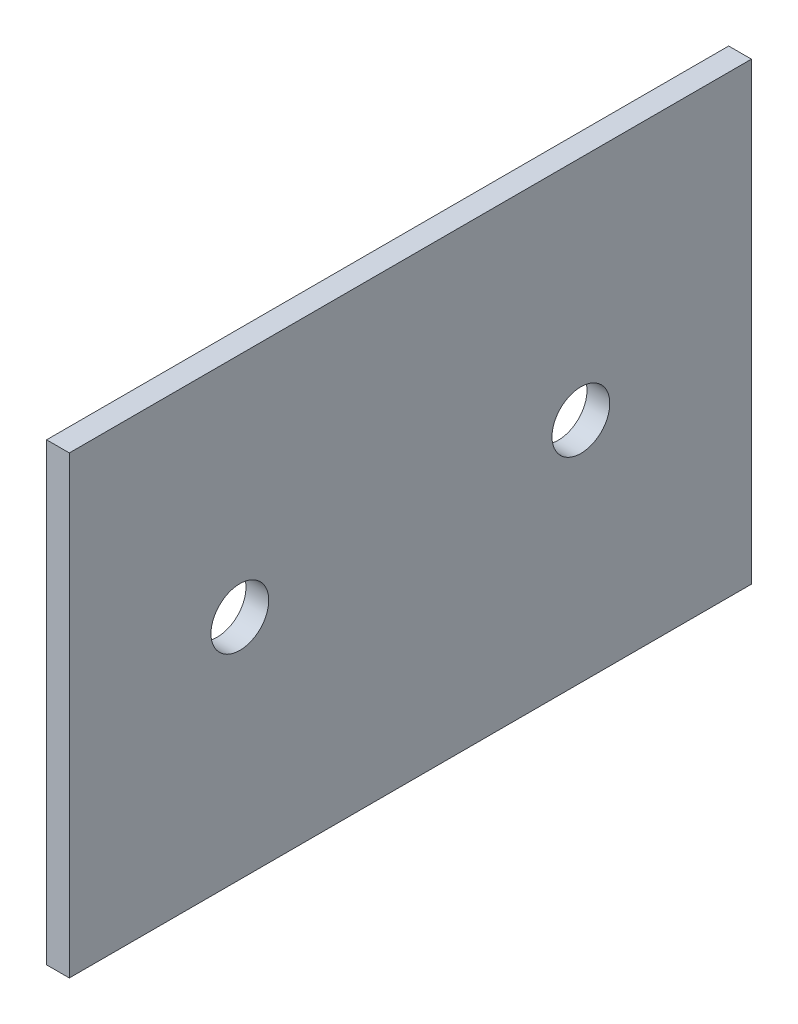
ISO-10303-21;
HEADER;
FILE_DESCRIPTION(('STEP AP214'),'2;1');
FILE_NAME('part.step','',(''),(''),'','','');
FILE_SCHEMA(('AUTOMOTIVE_DESIGN { 1 0 10303 214 1 1 1 1 }'));
ENDSEC;
DATA;
#1=APPLICATION_CONTEXT('core data for automotive mechanical design processes');
#2=APPLICATION_PROTOCOL_DEFINITION('international standard','automotive_design',2000,#1);
#3=PRODUCT_CONTEXT('',#1,'mechanical');
#4=PRODUCT('Part','Part','',(#3));
#5=PRODUCT_RELATED_PRODUCT_CATEGORY('part','',(#4));
#6=PRODUCT_DEFINITION_FORMATION('','',#4);
#7=PRODUCT_DEFINITION_CONTEXT('part definition',#1,'design');
#8=PRODUCT_DEFINITION('design','',#6,#7);
#9=PRODUCT_DEFINITION_SHAPE('','',#8);
#10=(LENGTH_UNIT() NAMED_UNIT(*) SI_UNIT(.MILLI.,.METRE.));
#11=(NAMED_UNIT(*) PLANE_ANGLE_UNIT() SI_UNIT($,.RADIAN.));
#12=(NAMED_UNIT(*) SI_UNIT($,.STERADIAN.) SOLID_ANGLE_UNIT());
#13=UNCERTAINTY_MEASURE_WITH_UNIT(LENGTH_MEASURE(1.E-05),#10,'distance_accuracy_value','');
#14=(GEOMETRIC_REPRESENTATION_CONTEXT(3) GLOBAL_UNCERTAINTY_ASSIGNED_CONTEXT((#13)) GLOBAL_UNIT_ASSIGNED_CONTEXT((#10,
#11,#12)) REPRESENTATION_CONTEXT('',''));
#15=CARTESIAN_POINT('',(0.,0.,0.));
#16=DIRECTION('',(0.,0.,1.));
#17=DIRECTION('',(1.,0.,0.));
#18=AXIS2_PLACEMENT_3D('',#15,#16,#17);
#19=CARTESIAN_POINT('',(110.,-100.,0.));
#20=DIRECTION('',(1.,0.,0.));
#21=DIRECTION('',(0.,1.,0.));
#22=AXIS2_PLACEMENT_3D('',#19,#20,#21);
#23=PLANE('',#22);
#24=CARTESIAN_POINT('',(110.,0.,225.));
#25=DIRECTION('',(1.,0.,0.));
#26=DIRECTION('',(0.,0.,1.));
#27=AXIS2_PLACEMENT_3D('',#24,#25,#26);
#28=CIRCLE('',#27,12.7);
#29=CARTESIAN_POINT('',(110.,0.,237.7));
#30=VERTEX_POINT('',#29);
#31=EDGE_CURVE('E10',#30,#30,#28,.T.);
#32=ORIENTED_EDGE('',*,*,#31,.F.);
#33=EDGE_LOOP('',(#32));
#34=FACE_BOUND('',#33,.T.);
#35=CARTESIAN_POINT('',(110.,0.,75.));
#36=DIRECTION('',(1.,0.,0.));
#37=DIRECTION('',(0.,0.,1.));
#38=AXIS2_PLACEMENT_3D('',#35,#36,#37);
#39=CIRCLE('',#38,12.7);
#40=CARTESIAN_POINT('',(110.,0.,87.7));
#41=VERTEX_POINT('',#40);
#42=EDGE_CURVE('E20',#41,#41,#39,.T.);
#43=ORIENTED_EDGE('',*,*,#42,.F.);
#44=EDGE_LOOP('',(#43));
#45=FACE_BOUND('',#44,.T.);
#46=DIRECTION('',(0.,0.,1.));
#47=VECTOR('',#46,1.);
#48=CARTESIAN_POINT('',(110.,-100.,0.));
#49=LINE('',#48,#47);
#50=CARTESIAN_POINT('',(110.,-100.,0.));
#51=VERTEX_POINT('',#50);
#52=CARTESIAN_POINT('',(110.,-100.,300.));
#53=VERTEX_POINT('',#52);
#54=EDGE_CURVE('E107',#51,#53,#49,.T.);
#55=ORIENTED_EDGE('',*,*,#54,.F.);
#56=DIRECTION('',(0.,1.,0.));
#57=VECTOR('',#56,1.);
#58=CARTESIAN_POINT('',(110.,-100.,0.));
#59=LINE('',#58,#57);
#60=CARTESIAN_POINT('',(110.,100.,0.));
#61=VERTEX_POINT('',#60);
#62=EDGE_CURVE('E110',#51,#61,#59,.T.);
#63=ORIENTED_EDGE('',*,*,#62,.T.);
#64=DIRECTION('',(0.,0.,1.));
#65=VECTOR('',#64,1.);
#66=CARTESIAN_POINT('',(110.,100.,0.));
#67=LINE('',#66,#65);
#68=CARTESIAN_POINT('',(110.,100.,300.));
#69=VERTEX_POINT('',#68);
#70=EDGE_CURVE('E113',#61,#69,#67,.T.);
#71=ORIENTED_EDGE('',*,*,#70,.T.);
#72=DIRECTION('',(0.,1.,0.));
#73=VECTOR('',#72,1.);
#74=CARTESIAN_POINT('',(110.,-100.,300.));
#75=LINE('',#74,#73);
#76=EDGE_CURVE('E84',#53,#69,#75,.T.);
#77=ORIENTED_EDGE('',*,*,#76,.F.);
#78=EDGE_LOOP('',(#55,#63,#71,#77));
#79=FACE_BOUND('',#78,.T.);
#80=ADVANCED_FACE('F16',(#34,#45,#79),#23,.T.);
#81=CARTESIAN_POINT('',(100.,0.,225.));
#82=DIRECTION('',(1.,0.,0.));
#83=DIRECTION('',(0.,0.,1.));
#84=AXIS2_PLACEMENT_3D('',#81,#82,#83);
#85=CYLINDRICAL_SURFACE('',#84,12.7);
#86=DIRECTION('',(1.,0.,0.));
#87=VECTOR('',#86,1.);
#88=CARTESIAN_POINT('',(100.,0.,237.7));
#89=LINE('',#88,#87);
#90=CARTESIAN_POINT('',(100.,0.,237.7));
#91=VERTEX_POINT('',#90);
#92=EDGE_CURVE('E27',#91,#30,#89,.T.);
#93=ORIENTED_EDGE('',*,*,#92,.F.);
#94=CARTESIAN_POINT('',(100.,0.,225.));
#95=DIRECTION('',(1.,0.,0.));
#96=DIRECTION('',(0.,0.,1.));
#97=AXIS2_PLACEMENT_3D('',#94,#95,#96);
#98=CIRCLE('',#97,12.7);
#99=EDGE_CURVE('E109',#91,#91,#98,.T.);
#100=ORIENTED_EDGE('',*,*,#99,.F.);
#101=ORIENTED_EDGE('',*,*,#92,.T.);
#102=ORIENTED_EDGE('',*,*,#31,.T.);
#103=EDGE_LOOP('',(#93,#100,#101,#102));
#104=FACE_BOUND('',#103,.T.);
#105=ADVANCED_FACE('F141',(#104),#85,.F.);
#106=CARTESIAN_POINT('',(100.,0.,75.));
#107=DIRECTION('',(1.,0.,0.));
#108=DIRECTION('',(0.,0.,1.));
#109=AXIS2_PLACEMENT_3D('',#106,#107,#108);
#110=CYLINDRICAL_SURFACE('',#109,12.7);
#111=DIRECTION('',(1.,0.,0.));
#112=VECTOR('',#111,1.);
#113=CARTESIAN_POINT('',(100.,0.,87.7));
#114=LINE('',#113,#112);
#115=CARTESIAN_POINT('',(100.,0.,87.7));
#116=VERTEX_POINT('',#115);
#117=EDGE_CURVE('E120',#116,#41,#114,.T.);
#118=ORIENTED_EDGE('',*,*,#117,.F.);
#119=CARTESIAN_POINT('',(100.,0.,75.));
#120=DIRECTION('',(1.,0.,0.));
#121=DIRECTION('',(0.,0.,1.));
#122=AXIS2_PLACEMENT_3D('',#119,#120,#121);
#123=CIRCLE('',#122,12.7);
#124=EDGE_CURVE('E132',#116,#116,#123,.T.);
#125=ORIENTED_EDGE('',*,*,#124,.F.);
#126=ORIENTED_EDGE('',*,*,#117,.T.);
#127=ORIENTED_EDGE('',*,*,#42,.T.);
#128=EDGE_LOOP('',(#118,#125,#126,#127));
#129=FACE_BOUND('',#128,.T.);
#130=ADVANCED_FACE('F225',(#129),#110,.F.);
#131=CARTESIAN_POINT('',(100.,100.,0.));
#132=DIRECTION('',(0.,1.,0.));
#133=DIRECTION('',(1.,0.,0.));
#134=AXIS2_PLACEMENT_3D('',#131,#132,#133);
#135=PLANE('',#134);
#136=DIRECTION('',(1.,0.,0.));
#137=VECTOR('',#136,1.);
#138=CARTESIAN_POINT('',(100.,100.,0.));
#139=LINE('',#138,#137);
#140=CARTESIAN_POINT('',(100.,100.,0.));
#141=VERTEX_POINT('',#140);
#142=EDGE_CURVE('E87',#141,#61,#139,.T.);
#143=ORIENTED_EDGE('',*,*,#142,.F.);
#144=DIRECTION('',(0.,0.,1.));
#145=VECTOR('',#144,1.);
#146=CARTESIAN_POINT('',(100.,100.,0.));
#147=LINE('',#146,#145);
#148=CARTESIAN_POINT('',(100.,100.,300.));
#149=VERTEX_POINT('',#148);
#150=EDGE_CURVE('E90',#141,#149,#147,.T.);
#151=ORIENTED_EDGE('',*,*,#150,.T.);
#152=DIRECTION('',(1.,0.,0.));
#153=VECTOR('',#152,1.);
#154=CARTESIAN_POINT('',(100.,100.,300.));
#155=LINE('',#154,#153);
#156=EDGE_CURVE('E79',#149,#69,#155,.T.);
#157=ORIENTED_EDGE('',*,*,#156,.T.);
#158=ORIENTED_EDGE('',*,*,#70,.F.);
#159=EDGE_LOOP('',(#143,#151,#157,#158));
#160=FACE_BOUND('',#159,.T.);
#161=ADVANCED_FACE('F91',(#160),#135,.T.);
#162=CARTESIAN_POINT('',(100.,-100.,0.));
#163=DIRECTION('',(0.,0.,1.));
#164=DIRECTION('',(1.,0.,0.));
#165=AXIS2_PLACEMENT_3D('',#162,#163,#164);
#166=PLANE('',#165);
#167=ORIENTED_EDGE('',*,*,#142,.T.);
#168=ORIENTED_EDGE('',*,*,#62,.F.);
#169=DIRECTION('',(1.,0.,0.));
#170=VECTOR('',#169,1.);
#171=CARTESIAN_POINT('',(100.,-100.,0.));
#172=LINE('',#171,#170);
#173=CARTESIAN_POINT('',(100.,-100.,0.));
#174=VERTEX_POINT('',#173);
#175=EDGE_CURVE('E128',#174,#51,#172,.T.);
#176=ORIENTED_EDGE('',*,*,#175,.F.);
#177=DIRECTION('',(0.,1.,0.));
#178=VECTOR('',#177,1.);
#179=CARTESIAN_POINT('',(100.,-100.,0.));
#180=LINE('',#179,#178);
#181=EDGE_CURVE('E97',#174,#141,#180,.T.);
#182=ORIENTED_EDGE('',*,*,#181,.T.);
#183=EDGE_LOOP('',(#167,#168,#176,#182));
#184=FACE_BOUND('',#183,.T.);
#185=ADVANCED_FACE('F168',(#184),#166,.F.);
#186=CARTESIAN_POINT('',(100.,-100.,300.));
#187=DIRECTION('',(0.,0.,1.));
#188=DIRECTION('',(1.,0.,0.));
#189=AXIS2_PLACEMENT_3D('',#186,#187,#188);
#190=PLANE('',#189);
#191=DIRECTION('',(0.,1.,0.));
#192=VECTOR('',#191,1.);
#193=CARTESIAN_POINT('',(100.,-100.,300.));
#194=LINE('',#193,#192);
#195=CARTESIAN_POINT('',(100.,-100.,300.));
#196=VERTEX_POINT('',#195);
#197=EDGE_CURVE('E83',#196,#149,#194,.T.);
#198=ORIENTED_EDGE('',*,*,#197,.F.);
#199=DIRECTION('',(1.,0.,0.));
#200=VECTOR('',#199,1.);
#201=CARTESIAN_POINT('',(100.,-100.,300.));
#202=LINE('',#201,#200);
#203=EDGE_CURVE('E71',#196,#53,#202,.T.);
#204=ORIENTED_EDGE('',*,*,#203,.T.);
#205=ORIENTED_EDGE('',*,*,#76,.T.);
#206=ORIENTED_EDGE('',*,*,#156,.F.);
#207=EDGE_LOOP('',(#198,#204,#205,#206));
#208=FACE_BOUND('',#207,.T.);
#209=ADVANCED_FACE('F81',(#208),#190,.T.);
#210=CARTESIAN_POINT('',(100.,-100.,0.));
#211=DIRECTION('',(0.,1.,0.));
#212=DIRECTION('',(1.,0.,0.));
#213=AXIS2_PLACEMENT_3D('',#210,#211,#212);
#214=PLANE('',#213);
#215=ORIENTED_EDGE('',*,*,#54,.T.);
#216=ORIENTED_EDGE('',*,*,#203,.F.);
#217=DIRECTION('',(0.,0.,1.));
#218=VECTOR('',#217,1.);
#219=CARTESIAN_POINT('',(100.,-100.,0.));
#220=LINE('',#219,#218);
#221=EDGE_CURVE('E98',#174,#196,#220,.T.);
#222=ORIENTED_EDGE('',*,*,#221,.F.);
#223=ORIENTED_EDGE('',*,*,#175,.T.);
#224=EDGE_LOOP('',(#215,#216,#222,#223));
#225=FACE_BOUND('',#224,.T.);
#226=ADVANCED_FACE('F178',(#225),#214,.F.);
#227=CARTESIAN_POINT('',(100.,-100.,0.));
#228=DIRECTION('',(1.,0.,0.));
#229=DIRECTION('',(0.,1.,0.));
#230=AXIS2_PLACEMENT_3D('',#227,#228,#229);
#231=PLANE('',#230);
#232=ORIENTED_EDGE('',*,*,#99,.T.);
#233=EDGE_LOOP('',(#232));
#234=FACE_BOUND('',#233,.T.);
#235=ORIENTED_EDGE('',*,*,#124,.T.);
#236=EDGE_LOOP('',(#235));
#237=FACE_BOUND('',#236,.T.);
#238=ORIENTED_EDGE('',*,*,#197,.T.);
#239=ORIENTED_EDGE('',*,*,#150,.F.);
#240=ORIENTED_EDGE('',*,*,#181,.F.);
#241=ORIENTED_EDGE('',*,*,#221,.T.);
#242=EDGE_LOOP('',(#238,#239,#240,#241));
#243=FACE_BOUND('',#242,.T.);
#244=ADVANCED_FACE('F18',(#234,#237,#243),#231,.F.);
#245=CLOSED_SHELL('',(#80,#105,#130,#161,#185,#209,#226,#244));
#246=MANIFOLD_SOLID_BREP('B1',#245);
#247=ADVANCED_BREP_SHAPE_REPRESENTATION('',(#18,#246),#14);
#248=SHAPE_DEFINITION_REPRESENTATION(#9,#247);
ENDSEC;
END-ISO-10303-21;
